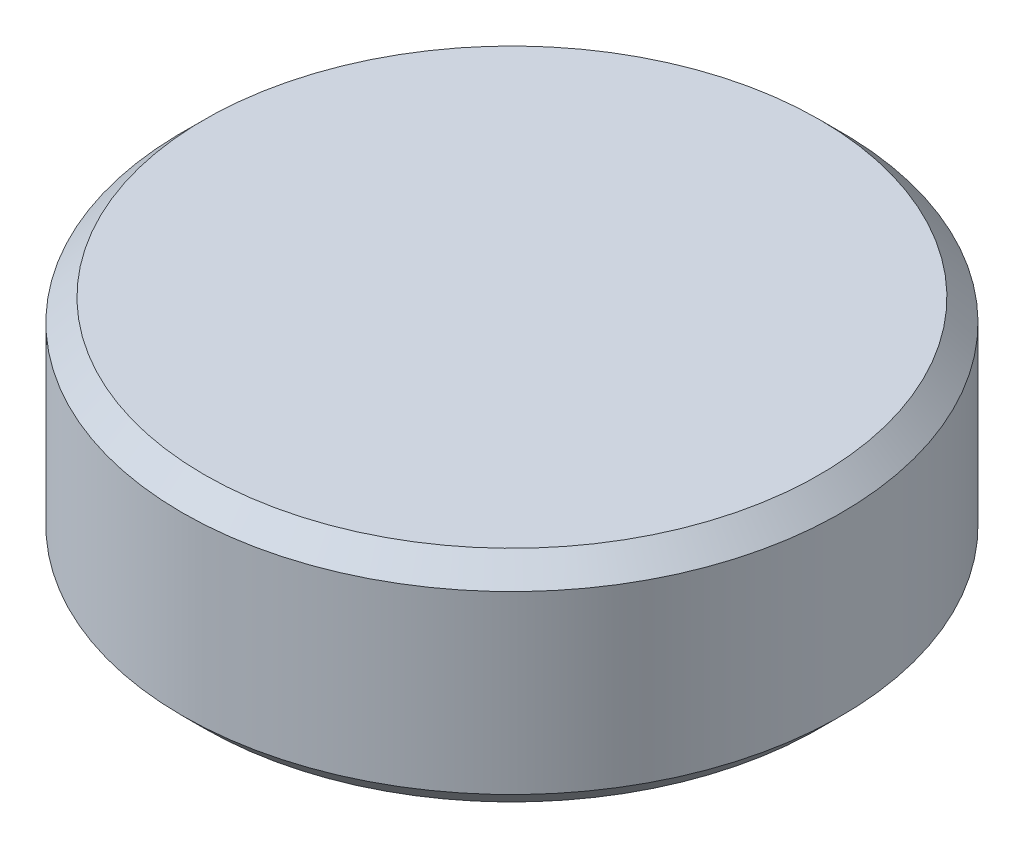
ISO-10303-21;
HEADER;
FILE_DESCRIPTION(('STEP AP214'),'2;1');
FILE_NAME('part.step','',(''),(''),'','','');
FILE_SCHEMA(('AUTOMOTIVE_DESIGN { 1 0 10303 214 1 1 1 1 }'));
ENDSEC;
DATA;
#1=APPLICATION_CONTEXT('core data for automotive mechanical design processes');
#2=APPLICATION_PROTOCOL_DEFINITION('international standard','automotive_design',2000,#1);
#3=PRODUCT_CONTEXT('',#1,'mechanical');
#4=PRODUCT('Part','Part','',(#3));
#5=PRODUCT_RELATED_PRODUCT_CATEGORY('part','',(#4));
#6=PRODUCT_DEFINITION_FORMATION('','',#4);
#7=PRODUCT_DEFINITION_CONTEXT('part definition',#1,'design');
#8=PRODUCT_DEFINITION('design','',#6,#7);
#9=PRODUCT_DEFINITION_SHAPE('','',#8);
#10=(LENGTH_UNIT() NAMED_UNIT(*) SI_UNIT(.MILLI.,.METRE.));
#11=(NAMED_UNIT(*) PLANE_ANGLE_UNIT() SI_UNIT($,.RADIAN.));
#12=(NAMED_UNIT(*) SI_UNIT($,.STERADIAN.) SOLID_ANGLE_UNIT());
#13=UNCERTAINTY_MEASURE_WITH_UNIT(LENGTH_MEASURE(1.E-05),#10,'distance_accuracy_value','');
#14=(GEOMETRIC_REPRESENTATION_CONTEXT(3) GLOBAL_UNCERTAINTY_ASSIGNED_CONTEXT((#13)) GLOBAL_UNIT_ASSIGNED_CONTEXT((#10,
#11,#12)) REPRESENTATION_CONTEXT('',''));
#15=CARTESIAN_POINT('',(0.,0.,0.));
#16=DIRECTION('',(0.,0.,1.));
#17=DIRECTION('',(1.,0.,0.));
#18=AXIS2_PLACEMENT_3D('',#15,#16,#17);
#19=CARTESIAN_POINT('',(0.,20.,0.));
#20=DIRECTION('',(0.,-1.,0.));
#21=DIRECTION('',(0.,0.,-1.));
#22=AXIS2_PLACEMENT_3D('',#19,#20,#21);
#23=CYLINDRICAL_SURFACE('',#22,30.);
#24=CARTESIAN_POINT('',(0.,2.,0.));
#25=DIRECTION('',(0.,1.,0.));
#26=DIRECTION('',(0.,0.,1.));
#27=AXIS2_PLACEMENT_3D('',#24,#25,#26);
#28=CIRCLE('',#27,30.);
#29=CARTESIAN_POINT('',(0.,2.,30.));
#30=VERTEX_POINT('',#29);
#31=EDGE_CURVE('E44',#30,#30,#28,.T.);
#32=ORIENTED_EDGE('',*,*,#31,.T.);
#33=EDGE_LOOP('',(#32));
#34=FACE_BOUND('',#33,.T.);
#35=CARTESIAN_POINT('',(0.,18.,0.));
#36=DIRECTION('',(0.,1.,0.));
#37=DIRECTION('',(0.,0.,1.));
#38=AXIS2_PLACEMENT_3D('',#35,#36,#37);
#39=CIRCLE('',#38,30.);
#40=CARTESIAN_POINT('',(0.,18.,30.));
#41=VERTEX_POINT('',#40);
#42=EDGE_CURVE('E48',#41,#41,#39,.F.);
#43=ORIENTED_EDGE('',*,*,#42,.T.);
#44=EDGE_LOOP('',(#43));
#45=FACE_BOUND('',#44,.T.);
#46=ADVANCED_FACE('F33',(#34,#45),#23,.T.);
#47=CARTESIAN_POINT('',(0.,20.,0.));
#48=DIRECTION('',(0.,1.,0.));
#49=DIRECTION('',(0.,0.,1.));
#50=AXIS2_PLACEMENT_3D('',#47,#48,#49);
#51=PLANE('',#50);
#52=CARTESIAN_POINT('',(0.,20.,0.));
#53=DIRECTION('',(0.,1.,0.));
#54=DIRECTION('',(0.,0.,1.));
#55=AXIS2_PLACEMENT_3D('',#52,#53,#54);
#56=CIRCLE('',#55,28.);
#57=CARTESIAN_POINT('',(0.,20.,28.));
#58=VERTEX_POINT('',#57);
#59=EDGE_CURVE('E10',#58,#58,#56,.T.);
#60=ORIENTED_EDGE('',*,*,#59,.T.);
#61=EDGE_LOOP('',(#60));
#62=FACE_BOUND('',#61,.T.);
#63=ADVANCED_FACE('F64',(#62),#51,.T.);
#64=CARTESIAN_POINT('',(0.,0.,0.));
#65=DIRECTION('',(0.,1.,0.));
#66=DIRECTION('',(0.,0.,1.));
#67=AXIS2_PLACEMENT_3D('',#64,#65,#66);
#68=PLANE('',#67);
#69=CARTESIAN_POINT('',(0.,0.,0.));
#70=DIRECTION('',(0.,1.,0.));
#71=DIRECTION('',(0.,0.,1.));
#72=AXIS2_PLACEMENT_3D('',#69,#70,#71);
#73=CIRCLE('',#72,28.);
#74=CARTESIAN_POINT('',(0.,0.,28.));
#75=VERTEX_POINT('',#74);
#76=EDGE_CURVE('E40',#75,#75,#73,.F.);
#77=ORIENTED_EDGE('',*,*,#76,.T.);
#78=EDGE_LOOP('',(#77));
#79=FACE_BOUND('',#78,.T.);
#80=ADVANCED_FACE('F61',(#79),#68,.F.);
#81=CARTESIAN_POINT('',(0.,2.,0.));
#82=DIRECTION('',(0.,1.,0.));
#83=DIRECTION('',(0.,0.,1.));
#84=AXIS2_PLACEMENT_3D('',#81,#82,#83);
#85=CONICAL_SURFACE('',#84,30.,0.78539816339745);
#86=ORIENTED_EDGE('',*,*,#76,.F.);
#87=EDGE_LOOP('',(#86));
#88=FACE_BOUND('',#87,.T.);
#89=ORIENTED_EDGE('',*,*,#31,.F.);
#90=EDGE_LOOP('',(#89));
#91=FACE_BOUND('',#90,.T.);
#92=ADVANCED_FACE('F57',(#88,#91),#85,.T.);
#93=CARTESIAN_POINT('',(0.,20.,0.));
#94=DIRECTION('',(0.,-1.,0.));
#95=DIRECTION('',(0.,0.,-1.));
#96=AXIS2_PLACEMENT_3D('',#93,#94,#95);
#97=CONICAL_SURFACE('',#96,28.,0.785398163397447);
#98=ORIENTED_EDGE('',*,*,#42,.F.);
#99=EDGE_LOOP('',(#98));
#100=FACE_BOUND('',#99,.T.);
#101=ORIENTED_EDGE('',*,*,#59,.F.);
#102=EDGE_LOOP('',(#101));
#103=FACE_BOUND('',#102,.T.);
#104=ADVANCED_FACE('F35',(#100,#103),#97,.T.);
#105=CLOSED_SHELL('',(#46,#63,#80,#92,#104));
#106=MANIFOLD_SOLID_BREP('B2',#105);
#107=ADVANCED_BREP_SHAPE_REPRESENTATION('',(#18,#106),#14);
#108=SHAPE_DEFINITION_REPRESENTATION(#9,#107);
ENDSEC;
END-ISO-10303-21;
